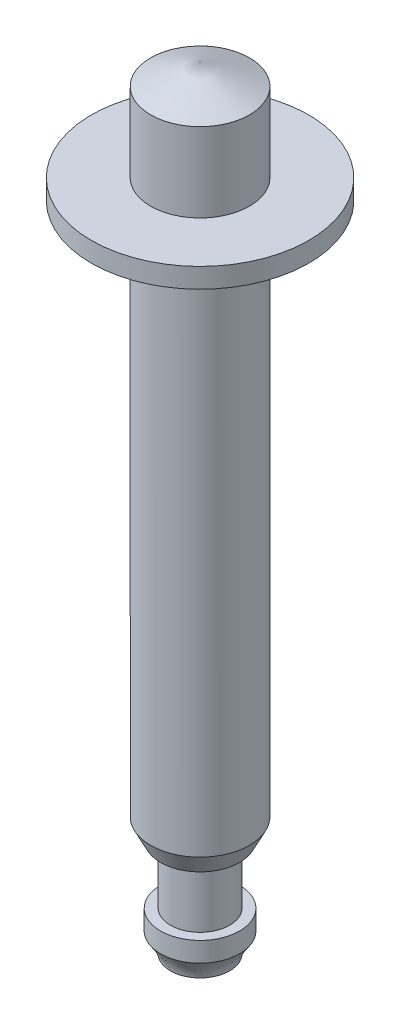
ISO-10303-21;
HEADER;
FILE_DESCRIPTION(('STEP AP214'),'2;1');
FILE_NAME('part.step','',(''),(''),'','','');
FILE_SCHEMA(('AUTOMOTIVE_DESIGN { 1 0 10303 214 1 1 1 1 }'));
ENDSEC;
DATA;
#1=APPLICATION_CONTEXT('core data for automotive mechanical design processes');
#2=APPLICATION_PROTOCOL_DEFINITION('international standard','automotive_design',2000,#1);
#3=PRODUCT_CONTEXT('',#1,'mechanical');
#4=PRODUCT('Part','Part','',(#3));
#5=PRODUCT_RELATED_PRODUCT_CATEGORY('part','',(#4));
#6=PRODUCT_DEFINITION_FORMATION('','',#4);
#7=PRODUCT_DEFINITION_CONTEXT('part definition',#1,'design');
#8=PRODUCT_DEFINITION('design','',#6,#7);
#9=PRODUCT_DEFINITION_SHAPE('','',#8);
#10=(LENGTH_UNIT() NAMED_UNIT(*) SI_UNIT(.MILLI.,.METRE.));
#11=(NAMED_UNIT(*) PLANE_ANGLE_UNIT() SI_UNIT($,.RADIAN.));
#12=(NAMED_UNIT(*) SI_UNIT($,.STERADIAN.) SOLID_ANGLE_UNIT());
#13=UNCERTAINTY_MEASURE_WITH_UNIT(LENGTH_MEASURE(1.E-05),#10,'distance_accuracy_value','');
#14=(GEOMETRIC_REPRESENTATION_CONTEXT(3) GLOBAL_UNCERTAINTY_ASSIGNED_CONTEXT((#13)) GLOBAL_UNIT_ASSIGNED_CONTEXT((#10,
#11,#12)) REPRESENTATION_CONTEXT('',''));
#15=CARTESIAN_POINT('',(0.,0.,0.));
#16=DIRECTION('',(0.,0.,1.));
#17=DIRECTION('',(1.,0.,0.));
#18=AXIS2_PLACEMENT_3D('',#15,#16,#17);
#19=CARTESIAN_POINT('',(0.,36.0579375371994,0.));
#20=DIRECTION('',(0.,-1.,0.));
#21=DIRECTION('',(0.,0.,-1.));
#22=AXIS2_PLACEMENT_3D('',#19,#20,#21);
#23=CONICAL_SURFACE('',#22,0.,1.54762545953449);
#24=CARTESIAN_POINT('',(0.,36.,0.));
#25=DIRECTION('',(0.,1.,0.));
#26=DIRECTION('',(0.,0.,1.));
#27=AXIS2_PLACEMENT_3D('',#24,#25,#26);
#28=CIRCLE('',#27,2.5);
#29=CARTESIAN_POINT('',(0.,36.,2.5));
#30=VERTEX_POINT('',#29);
#31=EDGE_CURVE('E13',#30,#30,#28,.T.);
#32=ORIENTED_EDGE('',*,*,#31,.F.);
#33=EDGE_LOOP('',(#32));
#34=FACE_BOUND('',#33,.T.);
#35=CARTESIAN_POINT('',(0.,36.0579375371994,0.));
#36=VERTEX_POINT('',#35);
#37=VERTEX_LOOP('',#36);
#38=FACE_BOUND('',#37,.T.);
#39=ADVANCED_FACE('F47',(#34,#38),#23,.F.);
#40=CARTESIAN_POINT('',(0.,36.,0.));
#41=DIRECTION('',(0.,-1.,0.));
#42=DIRECTION('',(0.,0.,-1.));
#43=AXIS2_PLACEMENT_3D('',#40,#41,#42);
#44=CONICAL_SURFACE('',#43,2.5,1.17047247311784);
#45=CARTESIAN_POINT('',(0.,37.0579375371994,0.));
#46=VERTEX_POINT('',#45);
#47=VERTEX_LOOP('',#46);
#48=FACE_BOUND('',#47,.T.);
#49=ORIENTED_EDGE('',*,*,#31,.T.);
#50=EDGE_LOOP('',(#49));
#51=FACE_BOUND('',#50,.T.);
#52=ADVANCED_FACE('F58',(#48,#51),#44,.T.);
#53=CLOSED_SHELL('',(#39,#52));
#54=MANIFOLD_SOLID_BREP('B2',#53);
#55=CARTESIAN_POINT('',(0.,-1.,0.));
#56=DIRECTION('',(0.,1.,0.));
#57=DIRECTION('',(0.,0.,1.));
#58=AXIS2_PLACEMENT_3D('',#55,#56,#57);
#59=CYLINDRICAL_SURFACE('',#58,2.);
#60=CARTESIAN_POINT('',(0.,-1.,0.));
#61=DIRECTION('',(0.,1.,0.));
#62=DIRECTION('',(0.,0.,1.));
#63=AXIS2_PLACEMENT_3D('',#60,#61,#62);
#64=CIRCLE('',#63,2.);
#65=CARTESIAN_POINT('',(-0.945839765856424,-1.,1.76221086630535));
#66=VERTEX_POINT('',#65);
#67=EDGE_CURVE('E87',#66,#66,#64,.F.);
#68=ORIENTED_EDGE('',*,*,#67,.F.);
#69=EDGE_LOOP('',(#68));
#70=FACE_BOUND('',#69,.T.);
#71=CARTESIAN_POINT('',(0.,0.,0.));
#72=DIRECTION('',(0.,1.,0.));
#73=DIRECTION('',(0.,0.,1.));
#74=AXIS2_PLACEMENT_3D('',#71,#72,#73);
#75=CIRCLE('',#74,2.);
#76=CARTESIAN_POINT('',(0.,0.,2.));
#77=VERTEX_POINT('',#76);
#78=EDGE_CURVE('E46',#77,#77,#75,.T.);
#79=ORIENTED_EDGE('',*,*,#78,.F.);
#80=EDGE_LOOP('',(#79));
#81=FACE_BOUND('',#80,.T.);
#82=ADVANCED_FACE('F79',(#70,#81),#59,.T.);
#83=CARTESIAN_POINT('',(0.,0.,0.));
#84=DIRECTION('',(0.,1.,0.));
#85=DIRECTION('',(0.,0.,1.));
#86=AXIS2_PLACEMENT_3D('',#83,#84,#85);
#87=PLANE('',#86);
#88=CARTESIAN_POINT('',(0.,0.,0.));
#89=DIRECTION('',(0.,1.,0.));
#90=DIRECTION('',(0.,0.,1.));
#91=AXIS2_PLACEMENT_3D('',#88,#89,#90);
#92=CIRCLE('',#91,1.5);
#93=CARTESIAN_POINT('',(0.,0.,1.5));
#94=VERTEX_POINT('',#93);
#95=EDGE_CURVE('E147',#94,#94,#92,.T.);
#96=ORIENTED_EDGE('',*,*,#95,.F.);
#97=EDGE_LOOP('',(#96));
#98=FACE_BOUND('',#97,.T.);
#99=ORIENTED_EDGE('',*,*,#78,.T.);
#100=EDGE_LOOP('',(#99));
#101=FACE_BOUND('',#100,.T.);
#102=ADVANCED_FACE('F170',(#98,#101),#87,.T.);
#103=CARTESIAN_POINT('',(0.,-2.,0.));
#104=DIRECTION('',(0.,1.,0.));
#105=DIRECTION('',(0.,0.,1.));
#106=AXIS2_PLACEMENT_3D('',#103,#104,#105);
#107=PLANE('',#106);
#108=CARTESIAN_POINT('',(0.,-2.,0.));
#109=DIRECTION('',(0.,1.,0.));
#110=DIRECTION('',(0.,0.,1.));
#111=AXIS2_PLACEMENT_3D('',#108,#109,#110);
#112=CIRCLE('',#111,1.5);
#113=CARTESIAN_POINT('',(0.119567695077116,-2.,1.49522692802596));
#114=VERTEX_POINT('',#113);
#115=EDGE_CURVE('E92',#114,#114,#112,.T.);
#116=ORIENTED_EDGE('',*,*,#115,.F.);
#117=EDGE_LOOP('',(#116));
#118=FACE_BOUND('',#117,.T.);
#119=ADVANCED_FACE('F168',(#118),#107,.F.);
#120=CARTESIAN_POINT('',(0.119567695077116,-2.,1.49522692802596));
#121=CARTESIAN_POINT('',(-0.945839765856424,-1.,1.76221086630535));
#122=CARTESIAN_POINT('',(3.11002155112903,-2.,1.25609153787173));
#123=CARTESIAN_POINT('',(2.57858196675429,-1.,3.6538903980182));
#124=CARTESIAN_POINT('',(2.8708861609748,-2.,-1.73436231818019));
#125=CARTESIAN_POINT('',(4.47026149846713,-1.,0.129468665407493));
#126=CARTESIAN_POINT('',(-0.119567695077115,-2.,-1.49522692802596));
#127=CARTESIAN_POINT('',(0.945839765856423,-1.,-1.76221086630535));
#128=CARTESIAN_POINT('',(-3.11002155112903,-2.,-1.25609153787173));
#129=CARTESIAN_POINT('',(-2.57858196675429,-1.,-3.6538903980182));
#130=CARTESIAN_POINT('',(-2.8708861609748,-2.,1.73436231818019));
#131=CARTESIAN_POINT('',(-4.47026149846713,-1.,-0.129468665407491));
#132=CARTESIAN_POINT('',(0.119567695077116,-2.,1.49522692802596));
#133=CARTESIAN_POINT('',(-0.945839765856424,-1.,1.76221086630535));
#134=(BOUNDED_SURFACE() B_SPLINE_SURFACE(3,1,((#120,#121),(#122,#123),(#124,#125),(#126,#127),
(#128,#129),(#130,#131),(#132,#133)),.UNSPECIFIED.,.T.,.F.,.F.) B_SPLINE_SURFACE_WITH_KNOTS((4,
3,4),(2,2),(0.,0.5,1.),(0.,1.),
.UNSPECIFIED.) GEOMETRIC_REPRESENTATION_ITEM() RATIONAL_B_SPLINE_SURFACE(((1.,1.),
(0.333333333333333,0.333333333333333),(0.333333333333333,0.333333333333333),(1.,1.),
(0.333333333333333,0.333333333333333),(0.333333333333333,0.333333333333333),(1.,1.))) REPRESENTATION_ITEM('') SURFACE());
#135=CARTESIAN_POINT('',(0.119567695077116,-2.,1.49522692802596));
#136=CARTESIAN_POINT('',(0.108469700692391,-1.98958333333333,1.49800801071637));
#137=CARTESIAN_POINT('',(0.0973717063076668,-1.97916666666667,1.50078909340678));
#138=CARTESIAN_POINT('',(0.0751757175382181,-1.95833333333333,1.5063512587876));
#139=CARTESIAN_POINT('',(0.0640777231534937,-1.94791666666667,1.50913234147801));
#140=CARTESIAN_POINT('',(0.041881734384045,-1.92708333333333,1.51469450685883));
#141=CARTESIAN_POINT('',(0.0307837399993206,-1.91666666666667,1.51747558954924));
#142=CARTESIAN_POINT('',(0.0085877512298718,-1.89583333333333,1.52303775493006));
#143=CARTESIAN_POINT('',(-0.00251024315485252,-1.88541666666667,1.52581883762047));
#144=CARTESIAN_POINT('',(-0.0247062319243012,-1.86458333333333,1.53138100300129));
#145=CARTESIAN_POINT('',(-0.0358042263090256,-1.85416666666667,1.5341620856917));
#146=CARTESIAN_POINT('',(-0.0580002150784744,-1.83333333333333,1.53972425107252));
#147=CARTESIAN_POINT('',(-0.0690982094631988,-1.82291666666667,1.54250533376294));
#148=CARTESIAN_POINT('',(-0.0912941982326475,-1.80208333333333,1.54806749914376));
#149=CARTESIAN_POINT('',(-0.102392192617372,-1.79166666666667,1.55084858183417));
#150=CARTESIAN_POINT('',(-0.124588181386821,-1.77083333333333,1.55641074721499));
#151=CARTESIAN_POINT('',(-0.135686175771545,-1.76041666666667,1.5591918299054));
#152=CARTESIAN_POINT('',(-0.157882164540994,-1.73958333333333,1.56475399528622));
#153=CARTESIAN_POINT('',(-0.168980158925718,-1.72916666666667,1.56753507797663));
#154=CARTESIAN_POINT('',(-0.191176147695167,-1.70833333333333,1.57309724335745));
#155=CARTESIAN_POINT('',(-0.202274142079891,-1.69791666666667,1.57587832604786));
#156=CARTESIAN_POINT('',(-0.22447013084934,-1.67708333333333,1.58144049142868));
#157=CARTESIAN_POINT('',(-0.235568125234064,-1.66666666666667,1.58422157411909));
#158=CARTESIAN_POINT('',(-0.257764114003513,-1.64583333333333,1.58978373949991));
#159=CARTESIAN_POINT('',(-0.268862108388238,-1.63541666666667,1.59256482219032));
#160=CARTESIAN_POINT('',(-0.291058097157686,-1.61458333333333,1.59812698757114));
#161=CARTESIAN_POINT('',(-0.302156091542411,-1.60416666666667,1.60090807026155));
#162=CARTESIAN_POINT('',(-0.324352080311859,-1.58333333333333,1.60647023564237));
#163=CARTESIAN_POINT('',(-0.335450074696584,-1.57291666666667,1.60925131833278));
#164=CARTESIAN_POINT('',(-0.357646063466033,-1.55208333333333,1.6148134837136));
#165=CARTESIAN_POINT('',(-0.368744057850757,-1.54166666666667,1.61759456640401));
#166=CARTESIAN_POINT('',(-0.390940046620206,-1.52083333333333,1.62315673178484));
#167=CARTESIAN_POINT('',(-0.40203804100493,-1.51041666666667,1.62593781447525));
#168=CARTESIAN_POINT('',(-0.424234029774379,-1.48958333333333,1.63149997985607));
#169=CARTESIAN_POINT('',(-0.435332024159103,-1.47916666666667,1.63428106254648));
#170=CARTESIAN_POINT('',(-0.457528012928552,-1.45833333333333,1.6398432279273));
#171=CARTESIAN_POINT('',(-0.468626007313276,-1.44791666666667,1.64262431061771));
#172=CARTESIAN_POINT('',(-0.490821996082725,-1.42708333333333,1.64818647599853));
#173=CARTESIAN_POINT('',(-0.501919990467449,-1.41666666666667,1.65096755868894));
#174=CARTESIAN_POINT('',(-0.524115979236898,-1.39583333333333,1.65652972406976));
#175=CARTESIAN_POINT('',(-0.535213973621623,-1.38541666666667,1.65931080676017));
#176=CARTESIAN_POINT('',(-0.557409962391071,-1.36458333333333,1.66487297214099));
#177=CARTESIAN_POINT('',(-0.568507956775796,-1.35416666666667,1.6676540548314));
#178=CARTESIAN_POINT('',(-0.590703945545244,-1.33333333333333,1.67321622021222));
#179=CARTESIAN_POINT('',(-0.601801939929969,-1.32291666666667,1.67599730290263));
#180=CARTESIAN_POINT('',(-0.623997928699417,-1.30208333333333,1.68155946828345));
#181=CARTESIAN_POINT('',(-0.635095923084142,-1.29166666666667,1.68434055097386));
#182=CARTESIAN_POINT('',(-0.657291911853591,-1.27083333333333,1.68990271635468));
#183=CARTESIAN_POINT('',(-0.668389906238315,-1.26041666666667,1.69268379904509));
#184=CARTESIAN_POINT('',(-0.690585895007764,-1.23958333333333,1.69824596442592));
#185=CARTESIAN_POINT('',(-0.701683889392488,-1.22916666666667,1.70102704711633));
#186=CARTESIAN_POINT('',(-0.723879878161937,-1.20833333333333,1.70658921249715));
#187=CARTESIAN_POINT('',(-0.734977872546661,-1.19791666666667,1.70937029518756));
#188=CARTESIAN_POINT('',(-0.75717386131611,-1.17708333333333,1.71493246056838));
#189=CARTESIAN_POINT('',(-0.768271855700834,-1.16666666666667,1.71771354325879));
#190=CARTESIAN_POINT('',(-0.790467844470283,-1.14583333333333,1.72327570863961));
#191=CARTESIAN_POINT('',(-0.801565838855007,-1.13541666666667,1.72605679133002));
#192=CARTESIAN_POINT('',(-0.823761827624456,-1.11458333333333,1.73161895671084));
#193=CARTESIAN_POINT('',(-0.834859822009181,-1.10416666666667,1.73440003940125));
#194=CARTESIAN_POINT('',(-0.857055810778629,-1.08333333333333,1.73996220478207));
#195=CARTESIAN_POINT('',(-0.868153805163354,-1.07291666666667,1.74274328747248));
#196=CARTESIAN_POINT('',(-0.890349793932803,-1.05208333333333,1.7483054528533));
#197=CARTESIAN_POINT('',(-0.901447788317527,-1.04166666666667,1.75108653554371));
#198=CARTESIAN_POINT('',(-0.923643777086976,-1.02083333333333,1.75664870092453));
#199=CARTESIAN_POINT('',(-0.9347417714717,-1.01041666666667,1.75942978361494));
#200=CARTESIAN_POINT('',(-0.945839765856424,-1.,1.76221086630535));
#201=B_SPLINE_CURVE_WITH_KNOTS('',3,(#135,#136,#137,#138,#139,#140,#141,#142,#143,#144,#145,
#146,#147,#148,#149,#150,#151,#152,#153,#154,#155,#156,#157,#158,#159,#160,#161,#162,#163,#164,
#165,#166,#167,#168,#169,#170,#171,#172,#173,#174,#175,#176,#177,#178,#179,#180,#181,#182,#183,
#184,#185,#186,#187,#188,#189,#190,#191,#192,#193,#194,#195,#196,#197,#198,#199,#200),
.UNSPECIFIED.,.F.,.F.,(4,2,2,2,2,2,2,2,2,2,2,2,2,2,2,2,2,2,2,2,2,2,2,2,2,2,2,2,2,2,2,2,4),(0.,
0.0464183326138334,0.0928366652276667,0.1392549978415,0.185673330455333,0.232091663069167,
0.278509995683,0.324928328296833,0.371346660910667,0.4177649935245,0.464183326138333,
0.510601658752167,0.557019991366,0.603438323979834,0.649856656593667,0.6962749892075,
0.742693321821334,0.789111654435167,0.835529987049,0.881948319662834,0.928366652276667,
0.9747849848905,1.02120331750433,1.06762165011817,1.114039982732,1.16045831534583,
1.20687664795967,1.2532949805735,1.29971331318733,1.34613164580117,1.392549978415,
1.43896831102883,1.48538664364267),.UNSPECIFIED.);
#202=EDGE_CURVE('BSEAM158',#114,#66,#201,.T.);
#203=ORIENTED_EDGE('',*,*,#115,.T.);
#204=ORIENTED_EDGE('',*,*,#67,.T.);
#205=ORIENTED_EDGE('',*,*,#202,.T.);
#206=ORIENTED_EDGE('',*,*,#202,.F.);
#207=EDGE_LOOP('',(#203,#205,#204,#206));
#208=FACE_BOUND('',#207,.T.);
#209=ADVANCED_FACE('F158',(#208),#134,.T.);
#210=CARTESIAN_POINT('',(0.,3.,0.));
#211=DIRECTION('',(0.,-1.,0.));
#212=DIRECTION('',(0.,0.,-1.));
#213=AXIS2_PLACEMENT_3D('',#210,#211,#212);
#214=CYLINDRICAL_SURFACE('',#213,1.5);
#215=CARTESIAN_POINT('',(0.,3.,0.));
#216=DIRECTION('',(0.,1.,0.));
#217=DIRECTION('',(0.,0.,1.));
#218=AXIS2_PLACEMENT_3D('',#215,#216,#217);
#219=CIRCLE('',#218,1.5);
#220=CARTESIAN_POINT('',(0.,3.,1.5));
#221=VERTEX_POINT('',#220);
#222=EDGE_CURVE('E144',#221,#221,#219,.T.);
#223=ORIENTED_EDGE('',*,*,#222,.F.);
#224=EDGE_LOOP('',(#223));
#225=FACE_BOUND('',#224,.T.);
#226=ORIENTED_EDGE('',*,*,#95,.T.);
#227=EDGE_LOOP('',(#226));
#228=FACE_BOUND('',#227,.T.);
#229=ADVANCED_FACE('F121',(#225,#228),#214,.T.);
#230=CARTESIAN_POINT('',(0.,3.,0.));
#231=DIRECTION('',(0.,1.,0.));
#232=DIRECTION('',(0.,0.,1.));
#233=AXIS2_PLACEMENT_3D('',#230,#231,#232);
#234=PLANE('',#233);
#235=ORIENTED_EDGE('',*,*,#222,.T.);
#236=EDGE_LOOP('',(#235));
#237=FACE_BOUND('',#236,.T.);
#238=CARTESIAN_POINT('',(0.,3.,0.));
#239=DIRECTION('',(0.,1.,0.));
#240=DIRECTION('',(0.,0.,1.));
#241=AXIS2_PLACEMENT_3D('',#238,#239,#240);
#242=CIRCLE('',#241,2.);
#243=CARTESIAN_POINT('',(0.,3.,2.));
#244=VERTEX_POINT('',#243);
#245=EDGE_CURVE('E134',#244,#244,#242,.T.);
#246=ORIENTED_EDGE('',*,*,#245,.F.);
#247=EDGE_LOOP('',(#246));
#248=FACE_BOUND('',#247,.T.);
#249=ADVANCED_FACE('F118',(#237,#248),#234,.F.);
#250=CARTESIAN_POINT('',(0.,3.,0.));
#251=DIRECTION('',(0.,1.,0.));
#252=DIRECTION('',(0.,0.,1.));
#253=AXIS2_PLACEMENT_3D('',#250,#251,#252);
#254=CONICAL_SURFACE('',#253,2.,0.463647609000806);
#255=ORIENTED_EDGE('',*,*,#245,.T.);
#256=EDGE_LOOP('',(#255));
#257=FACE_BOUND('',#256,.T.);
#258=CARTESIAN_POINT('',(0.,4.,0.));
#259=DIRECTION('',(0.,1.,0.));
#260=DIRECTION('',(0.,0.,1.));
#261=AXIS2_PLACEMENT_3D('',#258,#259,#260);
#262=CIRCLE('',#261,2.5);
#263=CARTESIAN_POINT('',(0.,4.,-2.5));
#264=VERTEX_POINT('',#263);
#265=EDGE_CURVE('E82',#264,#264,#262,.T.);
#266=ORIENTED_EDGE('',*,*,#265,.F.);
#267=EDGE_LOOP('',(#266));
#268=FACE_BOUND('',#267,.T.);
#269=ADVANCED_FACE('F115',(#257,#268),#254,.T.);
#270=CARTESIAN_POINT('',(0.,30.,0.));
#271=DIRECTION('',(0.,-1.,0.));
#272=DIRECTION('',(0.,0.,-1.));
#273=AXIS2_PLACEMENT_3D('',#270,#271,#272);
#274=CYLINDRICAL_SURFACE('',#273,2.5);
#275=CARTESIAN_POINT('',(0.,30.,0.));
#276=DIRECTION('',(0.,1.,0.));
#277=DIRECTION('',(0.,0.,1.));
#278=AXIS2_PLACEMENT_3D('',#275,#276,#277);
#279=CIRCLE('',#278,2.5);
#280=CARTESIAN_POINT('',(0.,30.,-2.5));
#281=VERTEX_POINT('',#280);
#282=EDGE_CURVE('E141',#281,#281,#279,.T.);
#283=CARTESIAN_POINT('',(0.,30.,-2.5));
#284=CARTESIAN_POINT('',(0.,29.7291666666667,-2.5));
#285=CARTESIAN_POINT('',(0.,29.4583333333333,-2.5));
#286=CARTESIAN_POINT('',(0.,28.9166666666667,-2.5));
#287=CARTESIAN_POINT('',(0.,28.6458333333333,-2.5));
#288=CARTESIAN_POINT('',(0.,28.1041666666667,-2.5));
#289=CARTESIAN_POINT('',(0.,27.8333333333333,-2.5));
#290=CARTESIAN_POINT('',(0.,27.2916666666667,-2.5));
#291=CARTESIAN_POINT('',(0.,27.0208333333333,-2.5));
#292=CARTESIAN_POINT('',(0.,26.4791666666667,-2.5));
#293=CARTESIAN_POINT('',(0.,26.2083333333333,-2.5));
#294=CARTESIAN_POINT('',(0.,25.6666666666667,-2.5));
#295=CARTESIAN_POINT('',(0.,25.3958333333333,-2.5));
#296=CARTESIAN_POINT('',(0.,24.8541666666667,-2.5));
#297=CARTESIAN_POINT('',(0.,24.5833333333333,-2.5));
#298=CARTESIAN_POINT('',(0.,24.0416666666667,-2.5));
#299=CARTESIAN_POINT('',(0.,23.7708333333333,-2.5));
#300=CARTESIAN_POINT('',(0.,23.2291666666667,-2.5));
#301=CARTESIAN_POINT('',(0.,22.9583333333333,-2.5));
#302=CARTESIAN_POINT('',(0.,22.4166666666667,-2.5));
#303=CARTESIAN_POINT('',(0.,22.1458333333333,-2.5));
#304=CARTESIAN_POINT('',(0.,21.6041666666667,-2.5));
#305=CARTESIAN_POINT('',(0.,21.3333333333333,-2.5));
#306=CARTESIAN_POINT('',(0.,20.7916666666667,-2.5));
#307=CARTESIAN_POINT('',(0.,20.5208333333333,-2.5));
#308=CARTESIAN_POINT('',(0.,19.9791666666667,-2.5));
#309=CARTESIAN_POINT('',(0.,19.7083333333333,-2.5));
#310=CARTESIAN_POINT('',(0.,19.1666666666667,-2.5));
#311=CARTESIAN_POINT('',(0.,18.8958333333333,-2.5));
#312=CARTESIAN_POINT('',(0.,18.3541666666667,-2.5));
#313=CARTESIAN_POINT('',(0.,18.0833333333333,-2.5));
#314=CARTESIAN_POINT('',(0.,17.5416666666667,-2.5));
#315=CARTESIAN_POINT('',(0.,17.2708333333333,-2.5));
#316=CARTESIAN_POINT('',(0.,16.7291666666667,-2.5));
#317=CARTESIAN_POINT('',(0.,16.4583333333333,-2.5));
#318=CARTESIAN_POINT('',(0.,15.9166666666667,-2.5));
#319=CARTESIAN_POINT('',(0.,15.6458333333333,-2.5));
#320=CARTESIAN_POINT('',(0.,15.1041666666667,-2.5));
#321=CARTESIAN_POINT('',(0.,14.8333333333333,-2.5));
#322=CARTESIAN_POINT('',(0.,14.2916666666667,-2.5));
#323=CARTESIAN_POINT('',(0.,14.0208333333333,-2.5));
#324=CARTESIAN_POINT('',(0.,13.4791666666667,-2.5));
#325=CARTESIAN_POINT('',(0.,13.2083333333333,-2.5));
#326=CARTESIAN_POINT('',(0.,12.6666666666667,-2.5));
#327=CARTESIAN_POINT('',(0.,12.3958333333333,-2.5));
#328=CARTESIAN_POINT('',(0.,11.8541666666667,-2.5));
#329=CARTESIAN_POINT('',(0.,11.5833333333333,-2.5));
#330=CARTESIAN_POINT('',(0.,11.0416666666667,-2.5));
#331=CARTESIAN_POINT('',(0.,10.7708333333333,-2.5));
#332=CARTESIAN_POINT('',(0.,10.2291666666667,-2.5));
#333=CARTESIAN_POINT('',(0.,9.95833333333333,-2.5));
#334=CARTESIAN_POINT('',(0.,9.41666666666667,-2.5));
#335=CARTESIAN_POINT('',(0.,9.14583333333333,-2.5));
#336=CARTESIAN_POINT('',(0.,8.60416666666667,-2.5));
#337=CARTESIAN_POINT('',(0.,8.33333333333333,-2.5));
#338=CARTESIAN_POINT('',(0.,7.79166666666667,-2.5));
#339=CARTESIAN_POINT('',(0.,7.52083333333333,-2.5));
#340=CARTESIAN_POINT('',(0.,6.97916666666667,-2.5));
#341=CARTESIAN_POINT('',(0.,6.70833333333333,-2.5));
#342=CARTESIAN_POINT('',(0.,6.16666666666667,-2.5));
#343=CARTESIAN_POINT('',(0.,5.89583333333333,-2.5));
#344=CARTESIAN_POINT('',(0.,5.35416666666667,-2.5));
#345=CARTESIAN_POINT('',(0.,5.08333333333333,-2.5));
#346=CARTESIAN_POINT('',(0.,4.54166666666667,-2.5));
#347=CARTESIAN_POINT('',(0.,4.27083333333333,-2.5));
#348=CARTESIAN_POINT('',(0.,4.,-2.5));
#349=B_SPLINE_CURVE_WITH_KNOTS('',3,(#283,#284,#285,#286,#287,#288,#289,#290,#291,#292,#293,
#294,#295,#296,#297,#298,#299,#300,#301,#302,#303,#304,#305,#306,#307,#308,#309,#310,#311,#312,
#313,#314,#315,#316,#317,#318,#319,#320,#321,#322,#323,#324,#325,#326,#327,#328,#329,#330,#331,
#332,#333,#334,#335,#336,#337,#338,#339,#340,#341,#342,#343,#344,#345,#346,#347,#348),
.UNSPECIFIED.,.F.,.F.,(4,2,2,2,2,2,2,2,2,2,2,2,2,2,2,2,2,2,2,2,2,2,2,2,2,2,2,2,2,2,2,2,4),(0.,
0.812500000000001,1.625,2.4375,3.25,4.0625,4.875,5.6875,6.5,7.3125,8.125,8.9375,9.75,10.5625,
11.375,12.1875,13.,13.8125,14.625,15.4375,16.25,17.0625,17.875,18.6875,19.5,20.3125,21.125,
21.9375,22.75,23.5625,24.375,25.1875,26.),.UNSPECIFIED.);
#350=EDGE_CURVE('BSEAM104',#281,#264,#349,.T.);
#351=ORIENTED_EDGE('',*,*,#282,.F.);
#352=ORIENTED_EDGE('',*,*,#265,.T.);
#353=ORIENTED_EDGE('',*,*,#350,.T.);
#354=ORIENTED_EDGE('',*,*,#350,.F.);
#355=EDGE_LOOP('',(#351,#353,#352,#354));
#356=FACE_BOUND('',#355,.T.);
#357=ADVANCED_FACE('F104',(#356),#274,.T.);
#358=CARTESIAN_POINT('',(0.,31.,0.));
#359=DIRECTION('',(0.,-1.,0.));
#360=DIRECTION('',(0.,0.,-1.));
#361=AXIS2_PLACEMENT_3D('',#358,#359,#360);
#362=CYLINDRICAL_SURFACE('',#361,3.);
#363=CARTESIAN_POINT('',(0.,31.,0.));
#364=DIRECTION('',(0.,1.,0.));
#365=DIRECTION('',(0.,0.,1.));
#366=AXIS2_PLACEMENT_3D('',#363,#364,#365);
#367=CIRCLE('',#366,3.);
#368=CARTESIAN_POINT('',(0.,31.,3.));
#369=VERTEX_POINT('',#368);
#370=EDGE_CURVE('E296',#369,#369,#367,.T.);
#371=ORIENTED_EDGE('',*,*,#370,.F.);
#372=EDGE_LOOP('',(#371));
#373=FACE_BOUND('',#372,.T.);
#374=CARTESIAN_POINT('',(0.,30.,0.));
#375=DIRECTION('',(0.,1.,0.));
#376=DIRECTION('',(0.,0.,1.));
#377=AXIS2_PLACEMENT_3D('',#374,#375,#376);
#378=CIRCLE('',#377,3.);
#379=CARTESIAN_POINT('',(0.,30.,3.));
#380=VERTEX_POINT('',#379);
#381=EDGE_CURVE('E294',#380,#380,#378,.T.);
#382=ORIENTED_EDGE('',*,*,#381,.T.);
#383=EDGE_LOOP('',(#382));
#384=FACE_BOUND('',#383,.T.);
#385=ADVANCED_FACE('F114',(#373,#384),#362,.T.);
#386=CARTESIAN_POINT('',(0.,30.,0.));
#387=DIRECTION('',(0.,1.,0.));
#388=DIRECTION('',(0.,0.,1.));
#389=AXIS2_PLACEMENT_3D('',#386,#387,#388);
#390=PLANE('',#389);
#391=ORIENTED_EDGE('',*,*,#282,.T.);
#392=EDGE_LOOP('',(#391));
#393=FACE_BOUND('',#392,.T.);
#394=ORIENTED_EDGE('',*,*,#381,.F.);
#395=EDGE_LOOP('',(#394));
#396=FACE_BOUND('',#395,.T.);
#397=ADVANCED_FACE('F216',(#393,#396),#390,.F.);
#398=CARTESIAN_POINT('',(0.,32.,0.));
#399=DIRECTION('',(0.,-1.,0.));
#400=DIRECTION('',(0.,0.,-1.));
#401=AXIS2_PLACEMENT_3D('',#398,#399,#400);
#402=CYLINDRICAL_SURFACE('',#401,5.5);
#403=CARTESIAN_POINT('',(0.,32.,0.));
#404=DIRECTION('',(0.,1.,0.));
#405=DIRECTION('',(0.,0.,1.));
#406=AXIS2_PLACEMENT_3D('',#403,#404,#405);
#407=CIRCLE('',#406,5.5);
#408=CARTESIAN_POINT('',(0.,32.,5.5));
#409=VERTEX_POINT('',#408);
#410=EDGE_CURVE('E288',#409,#409,#407,.T.);
#411=ORIENTED_EDGE('',*,*,#410,.F.);
#412=EDGE_LOOP('',(#411));
#413=FACE_BOUND('',#412,.T.);
#414=CARTESIAN_POINT('',(0.,31.,0.));
#415=DIRECTION('',(0.,1.,0.));
#416=DIRECTION('',(0.,0.,1.));
#417=AXIS2_PLACEMENT_3D('',#414,#415,#416);
#418=CIRCLE('',#417,5.5);
#419=CARTESIAN_POINT('',(0.,31.,5.5));
#420=VERTEX_POINT('',#419);
#421=EDGE_CURVE('E284',#420,#420,#418,.T.);
#422=ORIENTED_EDGE('',*,*,#421,.T.);
#423=EDGE_LOOP('',(#422));
#424=FACE_BOUND('',#423,.T.);
#425=ADVANCED_FACE('F223',(#413,#424),#402,.T.);
#426=CARTESIAN_POINT('',(0.,32.,0.));
#427=DIRECTION('',(0.,1.,0.));
#428=DIRECTION('',(0.,0.,1.));
#429=AXIS2_PLACEMENT_3D('',#426,#427,#428);
#430=PLANE('',#429);
#431=CARTESIAN_POINT('',(0.,32.,0.));
#432=DIRECTION('',(0.,1.,0.));
#433=DIRECTION('',(0.,0.,1.));
#434=AXIS2_PLACEMENT_3D('',#431,#432,#433);
#435=CIRCLE('',#434,2.5);
#436=CARTESIAN_POINT('',(0.,32.,2.5));
#437=VERTEX_POINT('',#436);
#438=EDGE_CURVE('E285',#437,#437,#435,.T.);
#439=ORIENTED_EDGE('',*,*,#438,.F.);
#440=EDGE_LOOP('',(#439));
#441=FACE_BOUND('',#440,.T.);
#442=ORIENTED_EDGE('',*,*,#410,.T.);
#443=EDGE_LOOP('',(#442));
#444=FACE_BOUND('',#443,.T.);
#445=ADVANCED_FACE('F230',(#441,#444),#430,.T.);
#446=CARTESIAN_POINT('',(0.,31.,0.));
#447=DIRECTION('',(0.,1.,0.));
#448=DIRECTION('',(0.,0.,1.));
#449=AXIS2_PLACEMENT_3D('',#446,#447,#448);
#450=PLANE('',#449);
#451=ORIENTED_EDGE('',*,*,#370,.T.);
#452=EDGE_LOOP('',(#451));
#453=FACE_BOUND('',#452,.T.);
#454=ORIENTED_EDGE('',*,*,#421,.F.);
#455=EDGE_LOOP('',(#454));
#456=FACE_BOUND('',#455,.T.);
#457=ADVANCED_FACE('F239',(#453,#456),#450,.F.);
#458=CARTESIAN_POINT('',(0.,36.,0.));
#459=DIRECTION('',(0.,-1.,0.));
#460=DIRECTION('',(0.,0.,-1.));
#461=AXIS2_PLACEMENT_3D('',#458,#459,#460);
#462=CYLINDRICAL_SURFACE('',#461,2.5);
#463=CARTESIAN_POINT('',(0.,36.,0.));
#464=DIRECTION('',(0.,1.,0.));
#465=DIRECTION('',(0.,0.,1.));
#466=AXIS2_PLACEMENT_3D('',#463,#464,#465);
#467=CIRCLE('',#466,2.5);
#468=CARTESIAN_POINT('',(0.,36.,2.5));
#469=VERTEX_POINT('',#468);
#470=EDGE_CURVE('E283',#469,#469,#467,.T.);
#471=ORIENTED_EDGE('',*,*,#470,.F.);
#472=EDGE_LOOP('',(#471));
#473=FACE_BOUND('',#472,.T.);
#474=ORIENTED_EDGE('',*,*,#438,.T.);
#475=EDGE_LOOP('',(#474));
#476=FACE_BOUND('',#475,.T.);
#477=ADVANCED_FACE('F247',(#473,#476),#462,.T.);
#478=CARTESIAN_POINT('',(0.,36.,0.));
#479=DIRECTION('',(0.,1.,0.));
#480=DIRECTION('',(0.,0.,1.));
#481=AXIS2_PLACEMENT_3D('',#478,#479,#480);
#482=PLANE('',#481);
#483=ORIENTED_EDGE('',*,*,#470,.T.);
#484=EDGE_LOOP('',(#483));
#485=FACE_BOUND('',#484,.T.);
#486=ADVANCED_FACE('F254',(#485),#482,.T.);
#487=CLOSED_SHELL('',(#82,#102,#119,#209,#229,#249,#269,#357,#385,#397,#425,#445,#457,#477,#486));
#488=MANIFOLD_SOLID_BREP('B7',#487);
#489=ADVANCED_BREP_SHAPE_REPRESENTATION('',(#18,#54,#488),#14);
#490=SHAPE_DEFINITION_REPRESENTATION(#9,#489);
ENDSEC;
END-ISO-10303-21;
